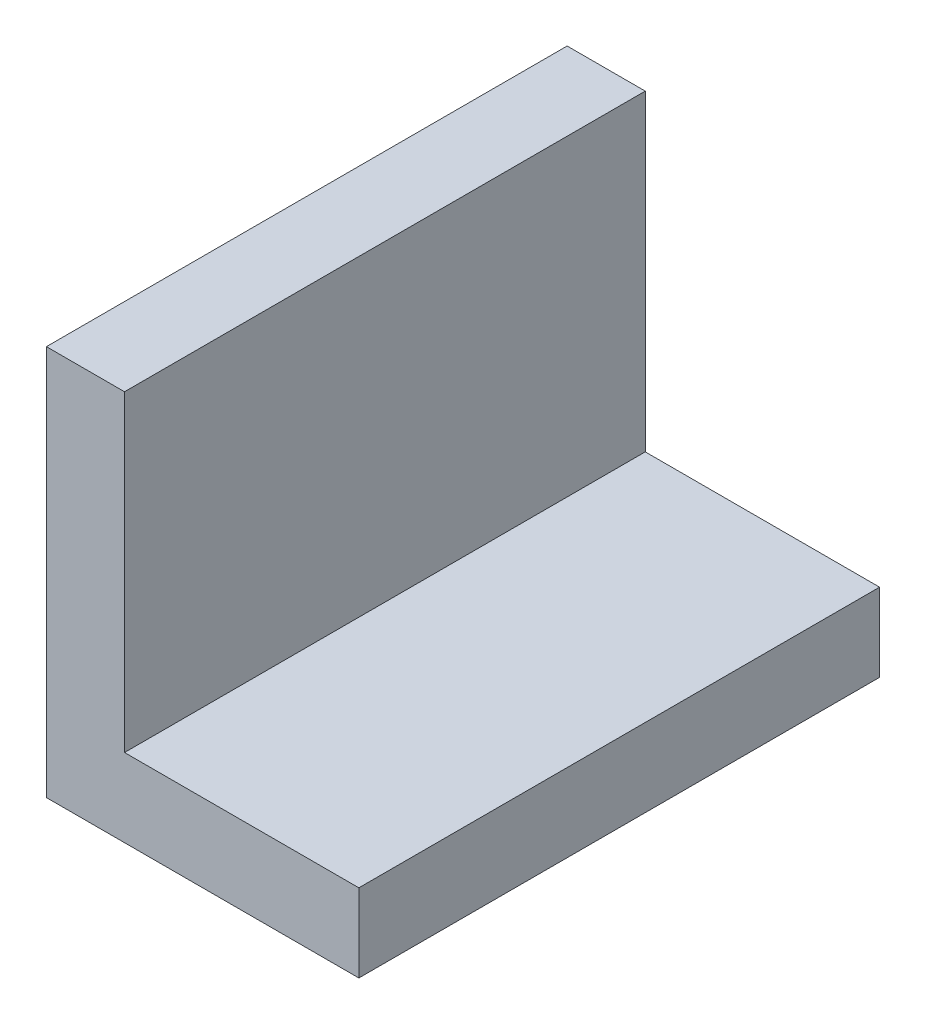
ISO-10303-21;
HEADER;
FILE_DESCRIPTION(('STEP AP214'),'2;1');
FILE_NAME('part.step','',(''),(''),'','','');
FILE_SCHEMA(('AUTOMOTIVE_DESIGN { 1 0 10303 214 1 1 1 1 }'));
ENDSEC;
DATA;
#1=APPLICATION_CONTEXT('core data for automotive mechanical design processes');
#2=APPLICATION_PROTOCOL_DEFINITION('international standard','automotive_design',2000,#1);
#3=PRODUCT_CONTEXT('',#1,'mechanical');
#4=PRODUCT('Part','Part','',(#3));
#5=PRODUCT_RELATED_PRODUCT_CATEGORY('part','',(#4));
#6=PRODUCT_DEFINITION_FORMATION('','',#4);
#7=PRODUCT_DEFINITION_CONTEXT('part definition',#1,'design');
#8=PRODUCT_DEFINITION('design','',#6,#7);
#9=PRODUCT_DEFINITION_SHAPE('','',#8);
#10=(LENGTH_UNIT() NAMED_UNIT(*) SI_UNIT(.MILLI.,.METRE.));
#11=(NAMED_UNIT(*) PLANE_ANGLE_UNIT() SI_UNIT($,.RADIAN.));
#12=(NAMED_UNIT(*) SI_UNIT($,.STERADIAN.) SOLID_ANGLE_UNIT());
#13=UNCERTAINTY_MEASURE_WITH_UNIT(LENGTH_MEASURE(1.E-05),#10,'distance_accuracy_value','');
#14=(GEOMETRIC_REPRESENTATION_CONTEXT(3) GLOBAL_UNCERTAINTY_ASSIGNED_CONTEXT((#13)) GLOBAL_UNIT_ASSIGNED_CONTEXT((#10,
#11,#12)) REPRESENTATION_CONTEXT('',''));
#15=CARTESIAN_POINT('',(0.,0.,0.));
#16=DIRECTION('',(0.,0.,1.));
#17=DIRECTION('',(1.,0.,0.));
#18=AXIS2_PLACEMENT_3D('',#15,#16,#17);
#19=CARTESIAN_POINT('',(60.,0.,100.));
#20=DIRECTION('',(0.,1.,0.));
#21=DIRECTION('',(-1.,0.,0.));
#22=AXIS2_PLACEMENT_3D('',#19,#20,#21);
#23=PLANE('',#22);
#24=DIRECTION('',(1.,0.,0.));
#25=VECTOR('',#24,1.);
#26=CARTESIAN_POINT('',(60.,0.,0.));
#27=LINE('',#26,#25);
#28=CARTESIAN_POINT('',(0.,0.,0.));
#29=VERTEX_POINT('',#28);
#30=CARTESIAN_POINT('',(60.,0.,0.));
#31=VERTEX_POINT('',#30);
#32=EDGE_CURVE('E128',#29,#31,#27,.T.);
#33=ORIENTED_EDGE('',*,*,#32,.T.);
#34=DIRECTION('',(0.,0.,-1.));
#35=VECTOR('',#34,1.);
#36=CARTESIAN_POINT('',(60.,0.,100.));
#37=LINE('',#36,#35);
#38=CARTESIAN_POINT('',(60.,0.,100.));
#39=VERTEX_POINT('',#38);
#40=EDGE_CURVE('E11',#39,#31,#37,.T.);
#41=ORIENTED_EDGE('',*,*,#40,.F.);
#42=DIRECTION('',(1.,0.,0.));
#43=VECTOR('',#42,1.);
#44=CARTESIAN_POINT('',(60.,0.,100.));
#45=LINE('',#44,#43);
#46=CARTESIAN_POINT('',(0.,0.,100.));
#47=VERTEX_POINT('',#46);
#48=EDGE_CURVE('E144',#47,#39,#45,.T.);
#49=ORIENTED_EDGE('',*,*,#48,.F.);
#50=DIRECTION('',(0.,0.,-1.));
#51=VECTOR('',#50,1.);
#52=CARTESIAN_POINT('',(0.,0.,100.));
#53=LINE('',#52,#51);
#54=EDGE_CURVE('E124',#47,#29,#53,.T.);
#55=ORIENTED_EDGE('',*,*,#54,.T.);
#56=EDGE_LOOP('',(#33,#41,#49,#55));
#57=FACE_BOUND('',#56,.T.);
#58=ADVANCED_FACE('F39',(#57),#23,.F.);
#59=CARTESIAN_POINT('',(60.,15.,100.));
#60=DIRECTION('',(-1.,0.,0.));
#61=DIRECTION('',(0.,0.,1.));
#62=AXIS2_PLACEMENT_3D('',#59,#60,#61);
#63=PLANE('',#62);
#64=DIRECTION('',(0.,1.,0.));
#65=VECTOR('',#64,1.);
#66=CARTESIAN_POINT('',(60.,15.,0.));
#67=LINE('',#66,#65);
#68=CARTESIAN_POINT('',(60.,15.,0.));
#69=VERTEX_POINT('',#68);
#70=EDGE_CURVE('E132',#31,#69,#67,.T.);
#71=ORIENTED_EDGE('',*,*,#70,.T.);
#72=DIRECTION('',(0.,0.,-1.));
#73=VECTOR('',#72,1.);
#74=CARTESIAN_POINT('',(60.,15.,100.));
#75=LINE('',#74,#73);
#76=CARTESIAN_POINT('',(60.,15.,100.));
#77=VERTEX_POINT('',#76);
#78=EDGE_CURVE('E48',#77,#69,#75,.T.);
#79=ORIENTED_EDGE('',*,*,#78,.F.);
#80=DIRECTION('',(0.,1.,0.));
#81=VECTOR('',#80,1.);
#82=CARTESIAN_POINT('',(60.,15.,100.));
#83=LINE('',#82,#81);
#84=EDGE_CURVE('E93',#39,#77,#83,.T.);
#85=ORIENTED_EDGE('',*,*,#84,.F.);
#86=ORIENTED_EDGE('',*,*,#40,.T.);
#87=EDGE_LOOP('',(#71,#79,#85,#86));
#88=FACE_BOUND('',#87,.T.);
#89=ADVANCED_FACE('F172',(#88),#63,.F.);
#90=CARTESIAN_POINT('',(15.,15.,100.));
#91=DIRECTION('',(0.,-1.,0.));
#92=DIRECTION('',(0.,0.,-1.));
#93=AXIS2_PLACEMENT_3D('',#90,#91,#92);
#94=PLANE('',#93);
#95=DIRECTION('',(-1.,0.,0.));
#96=VECTOR('',#95,1.);
#97=CARTESIAN_POINT('',(15.,15.,0.));
#98=LINE('',#97,#96);
#99=CARTESIAN_POINT('',(15.,15.,0.));
#100=VERTEX_POINT('',#99);
#101=EDGE_CURVE('E135',#69,#100,#98,.T.);
#102=ORIENTED_EDGE('',*,*,#101,.T.);
#103=DIRECTION('',(0.,0.,-1.));
#104=VECTOR('',#103,1.);
#105=CARTESIAN_POINT('',(15.,15.,100.));
#106=LINE('',#105,#104);
#107=CARTESIAN_POINT('',(15.,15.,100.));
#108=VERTEX_POINT('',#107);
#109=EDGE_CURVE('E117',#108,#100,#106,.T.);
#110=ORIENTED_EDGE('',*,*,#109,.F.);
#111=DIRECTION('',(-1.,0.,0.));
#112=VECTOR('',#111,1.);
#113=CARTESIAN_POINT('',(15.,15.,100.));
#114=LINE('',#113,#112);
#115=EDGE_CURVE('E106',#77,#108,#114,.T.);
#116=ORIENTED_EDGE('',*,*,#115,.F.);
#117=ORIENTED_EDGE('',*,*,#78,.T.);
#118=EDGE_LOOP('',(#102,#110,#116,#117));
#119=FACE_BOUND('',#118,.T.);
#120=ADVANCED_FACE('F154',(#119),#94,.F.);
#121=CARTESIAN_POINT('',(15.,75.,100.));
#122=DIRECTION('',(-1.,0.,0.));
#123=DIRECTION('',(0.,-1.,0.));
#124=AXIS2_PLACEMENT_3D('',#121,#122,#123);
#125=PLANE('',#124);
#126=DIRECTION('',(0.,1.,0.));
#127=VECTOR('',#126,1.);
#128=CARTESIAN_POINT('',(15.,75.,0.));
#129=LINE('',#128,#127);
#130=CARTESIAN_POINT('',(15.,75.,0.));
#131=VERTEX_POINT('',#130);
#132=EDGE_CURVE('E115',#100,#131,#129,.T.);
#133=ORIENTED_EDGE('',*,*,#132,.T.);
#134=DIRECTION('',(0.,0.,-1.));
#135=VECTOR('',#134,1.);
#136=CARTESIAN_POINT('',(15.,75.,100.));
#137=LINE('',#136,#135);
#138=CARTESIAN_POINT('',(15.,75.,100.));
#139=VERTEX_POINT('',#138);
#140=EDGE_CURVE('E112',#139,#131,#137,.T.);
#141=ORIENTED_EDGE('',*,*,#140,.F.);
#142=DIRECTION('',(0.,1.,0.));
#143=VECTOR('',#142,1.);
#144=CARTESIAN_POINT('',(15.,75.,100.));
#145=LINE('',#144,#143);
#146=EDGE_CURVE('E100',#108,#139,#145,.T.);
#147=ORIENTED_EDGE('',*,*,#146,.F.);
#148=ORIENTED_EDGE('',*,*,#109,.T.);
#149=EDGE_LOOP('',(#133,#141,#147,#148));
#150=FACE_BOUND('',#149,.T.);
#151=ADVANCED_FACE('F113',(#150),#125,.F.);
#152=CARTESIAN_POINT('',(0.,75.,100.));
#153=DIRECTION('',(0.,-1.,0.));
#154=DIRECTION('',(0.,0.,-1.));
#155=AXIS2_PLACEMENT_3D('',#152,#153,#154);
#156=PLANE('',#155);
#157=DIRECTION('',(-1.,0.,0.));
#158=VECTOR('',#157,1.);
#159=CARTESIAN_POINT('',(0.,75.,0.));
#160=LINE('',#159,#158);
#161=CARTESIAN_POINT('',(0.,75.,0.));
#162=VERTEX_POINT('',#161);
#163=EDGE_CURVE('E79',#131,#162,#160,.T.);
#164=ORIENTED_EDGE('',*,*,#163,.T.);
#165=DIRECTION('',(0.,0.,-1.));
#166=VECTOR('',#165,1.);
#167=CARTESIAN_POINT('',(0.,75.,100.));
#168=LINE('',#167,#166);
#169=CARTESIAN_POINT('',(0.,75.,100.));
#170=VERTEX_POINT('',#169);
#171=EDGE_CURVE('E118',#170,#162,#168,.T.);
#172=ORIENTED_EDGE('',*,*,#171,.F.);
#173=DIRECTION('',(-1.,0.,0.));
#174=VECTOR('',#173,1.);
#175=CARTESIAN_POINT('',(0.,75.,100.));
#176=LINE('',#175,#174);
#177=EDGE_CURVE('E104',#139,#170,#176,.T.);
#178=ORIENTED_EDGE('',*,*,#177,.F.);
#179=ORIENTED_EDGE('',*,*,#140,.T.);
#180=EDGE_LOOP('',(#164,#172,#178,#179));
#181=FACE_BOUND('',#180,.T.);
#182=ADVANCED_FACE('F120',(#181),#156,.F.);
#183=CARTESIAN_POINT('',(0.,0.,100.));
#184=DIRECTION('',(1.,0.,0.));
#185=DIRECTION('',(0.,0.,-1.));
#186=AXIS2_PLACEMENT_3D('',#183,#184,#185);
#187=PLANE('',#186);
#188=DIRECTION('',(0.,-1.,0.));
#189=VECTOR('',#188,1.);
#190=CARTESIAN_POINT('',(0.,0.,0.));
#191=LINE('',#190,#189);
#192=EDGE_CURVE('E85',#162,#29,#191,.T.);
#193=ORIENTED_EDGE('',*,*,#192,.T.);
#194=ORIENTED_EDGE('',*,*,#54,.F.);
#195=DIRECTION('',(0.,-1.,0.));
#196=VECTOR('',#195,1.);
#197=CARTESIAN_POINT('',(0.,0.,100.));
#198=LINE('',#197,#196);
#199=EDGE_CURVE('E56',#170,#47,#198,.T.);
#200=ORIENTED_EDGE('',*,*,#199,.F.);
#201=ORIENTED_EDGE('',*,*,#171,.T.);
#202=EDGE_LOOP('',(#193,#194,#200,#201));
#203=FACE_BOUND('',#202,.T.);
#204=ADVANCED_FACE('F161',(#203),#187,.F.);
#205=CARTESIAN_POINT('',(0.,0.,100.));
#206=DIRECTION('',(0.,0.,-1.));
#207=DIRECTION('',(-1.,0.,0.));
#208=AXIS2_PLACEMENT_3D('',#205,#206,#207);
#209=PLANE('',#208);
#210=ORIENTED_EDGE('',*,*,#48,.T.);
#211=ORIENTED_EDGE('',*,*,#84,.T.);
#212=ORIENTED_EDGE('',*,*,#115,.T.);
#213=ORIENTED_EDGE('',*,*,#146,.T.);
#214=ORIENTED_EDGE('',*,*,#177,.T.);
#215=ORIENTED_EDGE('',*,*,#199,.T.);
#216=EDGE_LOOP('',(#210,#211,#212,#213,#214,#215));
#217=FACE_BOUND('',#216,.T.);
#218=ADVANCED_FACE('F102',(#217),#209,.F.);
#219=CARTESIAN_POINT('',(0.,0.,0.));
#220=DIRECTION('',(0.,0.,-1.));
#221=DIRECTION('',(-1.,0.,0.));
#222=AXIS2_PLACEMENT_3D('',#219,#220,#221);
#223=PLANE('',#222);
#224=ORIENTED_EDGE('',*,*,#32,.F.);
#225=ORIENTED_EDGE('',*,*,#192,.F.);
#226=ORIENTED_EDGE('',*,*,#163,.F.);
#227=ORIENTED_EDGE('',*,*,#132,.F.);
#228=ORIENTED_EDGE('',*,*,#101,.F.);
#229=ORIENTED_EDGE('',*,*,#70,.F.);
#230=EDGE_LOOP('',(#224,#225,#226,#227,#228,#229));
#231=FACE_BOUND('',#230,.T.);
#232=ADVANCED_FACE('F157',(#231),#223,.T.);
#233=CLOSED_SHELL('',(#58,#89,#120,#151,#182,#204,#218,#232));
#234=MANIFOLD_SOLID_BREP('B2',#233);
#235=ADVANCED_BREP_SHAPE_REPRESENTATION('',(#18,#234),#14);
#236=SHAPE_DEFINITION_REPRESENTATION(#9,#235);
ENDSEC;
END-ISO-10303-21;
